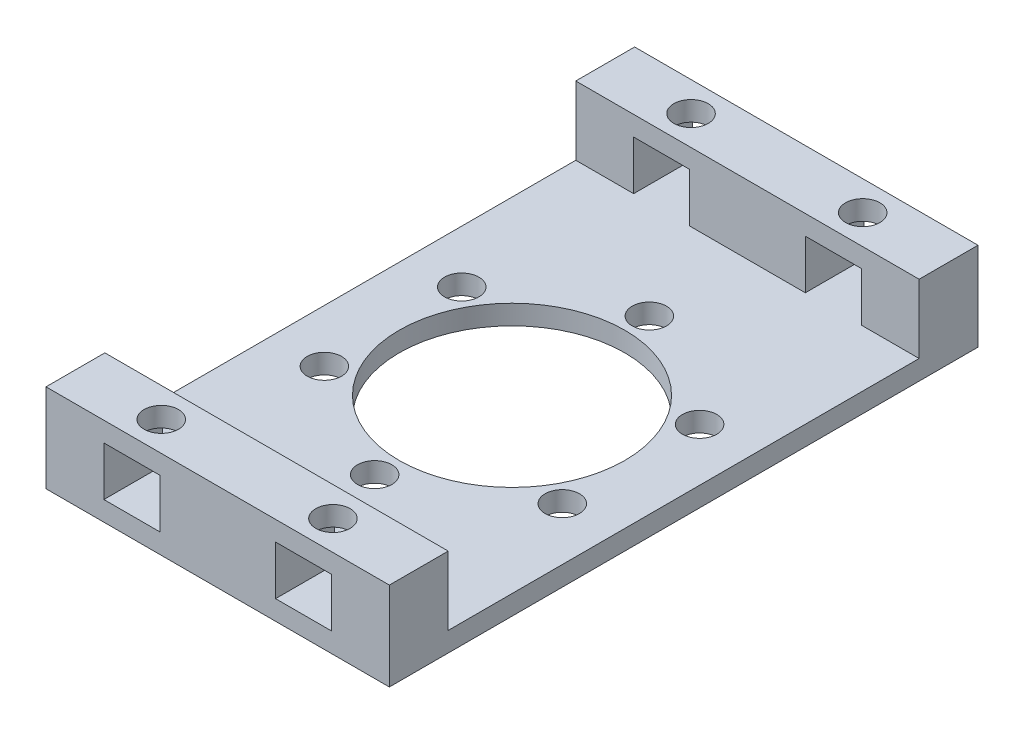
ISO-10303-21;
HEADER;
FILE_DESCRIPTION(('STEP AP214'),'2;1');
FILE_NAME('part.step','',(''),(''),'','','');
FILE_SCHEMA(('AUTOMOTIVE_DESIGN { 1 0 10303 214 1 1 1 1 }'));
ENDSEC;
DATA;
#1=APPLICATION_CONTEXT('core data for automotive mechanical design processes');
#2=APPLICATION_PROTOCOL_DEFINITION('international standard','automotive_design',2000,#1);
#3=PRODUCT_CONTEXT('',#1,'mechanical');
#4=PRODUCT('Part','Part','',(#3));
#5=PRODUCT_RELATED_PRODUCT_CATEGORY('part','',(#4));
#6=PRODUCT_DEFINITION_FORMATION('','',#4);
#7=PRODUCT_DEFINITION_CONTEXT('part definition',#1,'design');
#8=PRODUCT_DEFINITION('design','',#6,#7);
#9=PRODUCT_DEFINITION_SHAPE('','',#8);
#10=(LENGTH_UNIT() NAMED_UNIT(*) SI_UNIT(.MILLI.,.METRE.));
#11=(NAMED_UNIT(*) PLANE_ANGLE_UNIT() SI_UNIT($,.RADIAN.));
#12=(NAMED_UNIT(*) SI_UNIT($,.STERADIAN.) SOLID_ANGLE_UNIT());
#13=UNCERTAINTY_MEASURE_WITH_UNIT(LENGTH_MEASURE(1.E-05),#10,'distance_accuracy_value','');
#14=(GEOMETRIC_REPRESENTATION_CONTEXT(3) GLOBAL_UNCERTAINTY_ASSIGNED_CONTEXT((#13)) GLOBAL_UNIT_ASSIGNED_CONTEXT((#10,
#11,#12)) REPRESENTATION_CONTEXT('',''));
#15=CARTESIAN_POINT('',(0.,0.,0.));
#16=DIRECTION('',(0.,0.,1.));
#17=DIRECTION('',(1.,0.,0.));
#18=AXIS2_PLACEMENT_3D('',#15,#16,#17);
#19=CARTESIAN_POINT('',(-17.5,2.,-30.));
#20=DIRECTION('',(0.,0.,1.));
#21=DIRECTION('',(1.,0.,0.));
#22=AXIS2_PLACEMENT_3D('',#19,#20,#21);
#23=PLANE('',#22);
#24=DIRECTION('',(-1.,0.,0.));
#25=VECTOR('',#24,1.);
#26=CARTESIAN_POINT('',(-17.5,0.,-30.));
#27=LINE('',#26,#25);
#28=CARTESIAN_POINT('',(17.5,0.,-30.));
#29=VERTEX_POINT('',#28);
#30=CARTESIAN_POINT('',(-17.5,0.,-30.));
#31=VERTEX_POINT('',#30);
#32=EDGE_CURVE('E394',#29,#31,#27,.T.);
#33=ORIENTED_EDGE('',*,*,#32,.T.);
#34=DIRECTION('',(0.,-1.,0.));
#35=VECTOR('',#34,1.);
#36=CARTESIAN_POINT('',(-17.5,2.,-30.));
#37=LINE('',#36,#35);
#38=CARTESIAN_POINT('',(-17.5,9.,-30.));
#39=VERTEX_POINT('',#38);
#40=EDGE_CURVE('E404',#39,#31,#37,.T.);
#41=ORIENTED_EDGE('',*,*,#40,.F.);
#42=DIRECTION('',(-1.,0.,0.));
#43=VECTOR('',#42,1.);
#44=CARTESIAN_POINT('',(-17.5,9.,-30.));
#45=LINE('',#44,#43);
#46=CARTESIAN_POINT('',(17.5,9.,-30.));
#47=VERTEX_POINT('',#46);
#48=EDGE_CURVE('E304',#47,#39,#45,.T.);
#49=ORIENTED_EDGE('',*,*,#48,.F.);
#50=DIRECTION('',(0.,-1.,0.));
#51=VECTOR('',#50,1.);
#52=CARTESIAN_POINT('',(17.5,2.,-30.));
#53=LINE('',#52,#51);
#54=EDGE_CURVE('E407',#47,#29,#53,.T.);
#55=ORIENTED_EDGE('',*,*,#54,.T.);
#56=EDGE_LOOP('',(#33,#41,#49,#55));
#57=FACE_BOUND('',#56,.T.);
#58=DIRECTION('',(0.,1.,0.));
#59=VECTOR('',#58,1.);
#60=CARTESIAN_POINT('',(5.90000000000001,0.,-30.));
#61=LINE('',#60,#59);
#62=CARTESIAN_POINT('',(5.90000000000001,2.,-30.));
#63=VERTEX_POINT('',#62);
#64=CARTESIAN_POINT('',(5.90000000000001,7.,-30.));
#65=VERTEX_POINT('',#64);
#66=EDGE_CURVE('E260',#63,#65,#61,.T.);
#67=ORIENTED_EDGE('',*,*,#66,.F.);
#68=DIRECTION('',(1.,0.,0.));
#69=VECTOR('',#68,1.);
#70=CARTESIAN_POINT('',(0.,2.,-30.));
#71=LINE('',#70,#69);
#72=CARTESIAN_POINT('',(11.6,2.,-30.));
#73=VERTEX_POINT('',#72);
#74=EDGE_CURVE('E251',#63,#73,#71,.T.);
#75=ORIENTED_EDGE('',*,*,#74,.T.);
#76=DIRECTION('',(0.,1.,0.));
#77=VECTOR('',#76,1.);
#78=CARTESIAN_POINT('',(11.6,0.,-30.));
#79=LINE('',#78,#77);
#80=CARTESIAN_POINT('',(11.6,7.,-30.));
#81=VERTEX_POINT('',#80);
#82=EDGE_CURVE('E254',#73,#81,#79,.T.);
#83=ORIENTED_EDGE('',*,*,#82,.T.);
#84=DIRECTION('',(1.,0.,0.));
#85=VECTOR('',#84,1.);
#86=CARTESIAN_POINT('',(0.,7.,-30.));
#87=LINE('',#86,#85);
#88=EDGE_CURVE('E258',#65,#81,#87,.T.);
#89=ORIENTED_EDGE('',*,*,#88,.F.);
#90=EDGE_LOOP('',(#67,#75,#83,#89));
#91=FACE_BOUND('',#90,.T.);
#92=DIRECTION('',(1.,0.,0.));
#93=VECTOR('',#92,1.);
#94=CARTESIAN_POINT('',(0.,7.,-30.));
#95=LINE('',#94,#93);
#96=CARTESIAN_POINT('',(-11.6,7.,-30.));
#97=VERTEX_POINT('',#96);
#98=CARTESIAN_POINT('',(-5.89999999999999,7.,-30.));
#99=VERTEX_POINT('',#98);
#100=EDGE_CURVE('E209',#97,#99,#95,.T.);
#101=ORIENTED_EDGE('',*,*,#100,.F.);
#102=DIRECTION('',(0.,1.,0.));
#103=VECTOR('',#102,1.);
#104=CARTESIAN_POINT('',(-11.6,0.,-30.));
#105=LINE('',#104,#103);
#106=CARTESIAN_POINT('',(-11.6,2.,-30.));
#107=VERTEX_POINT('',#106);
#108=EDGE_CURVE('E201',#107,#97,#105,.T.);
#109=ORIENTED_EDGE('',*,*,#108,.F.);
#110=DIRECTION('',(1.,0.,0.));
#111=VECTOR('',#110,1.);
#112=CARTESIAN_POINT('',(0.,2.,-30.));
#113=LINE('',#112,#111);
#114=CARTESIAN_POINT('',(-5.89999999999999,2.,-30.));
#115=VERTEX_POINT('',#114);
#116=EDGE_CURVE('E54',#107,#115,#113,.T.);
#117=ORIENTED_EDGE('',*,*,#116,.T.);
#118=DIRECTION('',(0.,1.,0.));
#119=VECTOR('',#118,1.);
#120=CARTESIAN_POINT('',(-5.89999999999999,0.,-30.));
#121=LINE('',#120,#119);
#122=EDGE_CURVE('E222',#115,#99,#121,.T.);
#123=ORIENTED_EDGE('',*,*,#122,.T.);
#124=EDGE_LOOP('',(#101,#109,#117,#123));
#125=FACE_BOUND('',#124,.T.);
#126=ADVANCED_FACE('F39',(#57,#91,#125),#23,.F.);
#127=CARTESIAN_POINT('',(-17.5,2.,30.));
#128=DIRECTION('',(0.,0.,-1.));
#129=DIRECTION('',(-1.,0.,0.));
#130=AXIS2_PLACEMENT_3D('',#127,#128,#129);
#131=PLANE('',#130);
#132=DIRECTION('',(1.,0.,0.));
#133=VECTOR('',#132,1.);
#134=CARTESIAN_POINT('',(-17.5,0.,30.));
#135=LINE('',#134,#133);
#136=CARTESIAN_POINT('',(-17.5,0.,30.));
#137=VERTEX_POINT('',#136);
#138=CARTESIAN_POINT('',(17.5,0.,30.));
#139=VERTEX_POINT('',#138);
#140=EDGE_CURVE('E388',#137,#139,#135,.T.);
#141=ORIENTED_EDGE('',*,*,#140,.T.);
#142=DIRECTION('',(0.,-1.,0.));
#143=VECTOR('',#142,1.);
#144=CARTESIAN_POINT('',(17.5,2.,30.));
#145=LINE('',#144,#143);
#146=CARTESIAN_POINT('',(17.5,9.,30.));
#147=VERTEX_POINT('',#146);
#148=EDGE_CURVE('E391',#147,#139,#145,.T.);
#149=ORIENTED_EDGE('',*,*,#148,.F.);
#150=DIRECTION('',(1.,0.,0.));
#151=VECTOR('',#150,1.);
#152=CARTESIAN_POINT('',(-17.5,9.,30.));
#153=LINE('',#152,#151);
#154=CARTESIAN_POINT('',(-17.5,9.,30.));
#155=VERTEX_POINT('',#154);
#156=EDGE_CURVE('E324',#155,#147,#153,.T.);
#157=ORIENTED_EDGE('',*,*,#156,.F.);
#158=DIRECTION('',(0.,-1.,0.));
#159=VECTOR('',#158,1.);
#160=CARTESIAN_POINT('',(-17.5,2.,30.));
#161=LINE('',#160,#159);
#162=EDGE_CURVE('E401',#155,#137,#161,.T.);
#163=ORIENTED_EDGE('',*,*,#162,.T.);
#164=EDGE_LOOP('',(#141,#149,#157,#163));
#165=FACE_BOUND('',#164,.T.);
#166=DIRECTION('',(0.,1.,0.));
#167=VECTOR('',#166,1.);
#168=CARTESIAN_POINT('',(11.6,0.,30.));
#169=LINE('',#168,#167);
#170=CARTESIAN_POINT('',(11.6,2.,30.));
#171=VERTEX_POINT('',#170);
#172=CARTESIAN_POINT('',(11.6,7.,30.));
#173=VERTEX_POINT('',#172);
#174=EDGE_CURVE('E265',#171,#173,#169,.T.);
#175=ORIENTED_EDGE('',*,*,#174,.F.);
#176=DIRECTION('',(1.,0.,0.));
#177=VECTOR('',#176,1.);
#178=CARTESIAN_POINT('',(0.,2.,30.));
#179=LINE('',#178,#177);
#180=CARTESIAN_POINT('',(5.90000000000001,2.,30.));
#181=VERTEX_POINT('',#180);
#182=EDGE_CURVE('E263',#181,#171,#179,.T.);
#183=ORIENTED_EDGE('',*,*,#182,.F.);
#184=DIRECTION('',(0.,1.,0.));
#185=VECTOR('',#184,1.);
#186=CARTESIAN_POINT('',(5.90000000000001,0.,30.));
#187=LINE('',#186,#185);
#188=CARTESIAN_POINT('',(5.90000000000001,7.,30.));
#189=VERTEX_POINT('',#188);
#190=EDGE_CURVE('E255',#181,#189,#187,.T.);
#191=ORIENTED_EDGE('',*,*,#190,.T.);
#192=DIRECTION('',(1.,0.,0.));
#193=VECTOR('',#192,1.);
#194=CARTESIAN_POINT('',(0.,7.,30.));
#195=LINE('',#194,#193);
#196=EDGE_CURVE('E268',#189,#173,#195,.T.);
#197=ORIENTED_EDGE('',*,*,#196,.T.);
#198=EDGE_LOOP('',(#175,#183,#191,#197));
#199=FACE_BOUND('',#198,.T.);
#200=DIRECTION('',(1.,0.,0.));
#201=VECTOR('',#200,1.);
#202=CARTESIAN_POINT('',(0.,7.,30.));
#203=LINE('',#202,#201);
#204=CARTESIAN_POINT('',(-11.6,7.,30.));
#205=VERTEX_POINT('',#204);
#206=CARTESIAN_POINT('',(-5.89999999999999,7.,30.));
#207=VERTEX_POINT('',#206);
#208=EDGE_CURVE('E234',#205,#207,#203,.T.);
#209=ORIENTED_EDGE('',*,*,#208,.T.);
#210=DIRECTION('',(0.,1.,0.));
#211=VECTOR('',#210,1.);
#212=CARTESIAN_POINT('',(-5.89999999999999,0.,30.));
#213=LINE('',#212,#211);
#214=CARTESIAN_POINT('',(-5.89999999999999,2.,30.));
#215=VERTEX_POINT('',#214);
#216=EDGE_CURVE('E223',#215,#207,#213,.T.);
#217=ORIENTED_EDGE('',*,*,#216,.F.);
#218=DIRECTION('',(1.,0.,0.));
#219=VECTOR('',#218,1.);
#220=CARTESIAN_POINT('',(0.,2.,30.));
#221=LINE('',#220,#219);
#222=CARTESIAN_POINT('',(-11.6,2.,30.));
#223=VERTEX_POINT('',#222);
#224=EDGE_CURVE('E226',#223,#215,#221,.T.);
#225=ORIENTED_EDGE('',*,*,#224,.F.);
#226=DIRECTION('',(0.,1.,0.));
#227=VECTOR('',#226,1.);
#228=CARTESIAN_POINT('',(-11.6,0.,30.));
#229=LINE('',#228,#227);
#230=EDGE_CURVE('E237',#223,#205,#229,.T.);
#231=ORIENTED_EDGE('',*,*,#230,.T.);
#232=EDGE_LOOP('',(#209,#217,#225,#231));
#233=FACE_BOUND('',#232,.T.);
#234=ADVANCED_FACE('F455',(#165,#199,#233),#131,.F.);
#235=CARTESIAN_POINT('',(-17.5,9.,24.));
#236=DIRECTION('',(0.,0.,1.));
#237=DIRECTION('',(1.,0.,0.));
#238=AXIS2_PLACEMENT_3D('',#235,#236,#237);
#239=PLANE('',#238);
#240=DIRECTION('',(-1.,0.,0.));
#241=VECTOR('',#240,1.);
#242=CARTESIAN_POINT('',(-17.5,2.,24.));
#243=LINE('',#242,#241);
#244=CARTESIAN_POINT('',(5.90000000000001,2.,24.));
#245=VERTEX_POINT('',#244);
#246=CARTESIAN_POINT('',(-5.89999999999999,2.,24.));
#247=VERTEX_POINT('',#246);
#248=EDGE_CURVE('E335',#245,#247,#243,.T.);
#249=ORIENTED_EDGE('',*,*,#248,.T.);
#250=DIRECTION('',(0.,1.,0.));
#251=VECTOR('',#250,1.);
#252=CARTESIAN_POINT('',(-5.89999999999999,9.,24.));
#253=LINE('',#252,#251);
#254=CARTESIAN_POINT('',(-5.89999999999999,7.,24.));
#255=VERTEX_POINT('',#254);
#256=EDGE_CURVE('E293',#247,#255,#253,.T.);
#257=ORIENTED_EDGE('',*,*,#256,.T.);
#258=DIRECTION('',(1.,0.,0.));
#259=VECTOR('',#258,1.);
#260=CARTESIAN_POINT('',(-17.5,7.,24.));
#261=LINE('',#260,#259);
#262=CARTESIAN_POINT('',(-11.6,7.,24.));
#263=VERTEX_POINT('',#262);
#264=EDGE_CURVE('E296',#263,#255,#261,.T.);
#265=ORIENTED_EDGE('',*,*,#264,.F.);
#266=DIRECTION('',(0.,1.,0.));
#267=VECTOR('',#266,1.);
#268=CARTESIAN_POINT('',(-11.6,9.,24.));
#269=LINE('',#268,#267);
#270=CARTESIAN_POINT('',(-11.6,2.,24.));
#271=VERTEX_POINT('',#270);
#272=EDGE_CURVE('E291',#271,#263,#269,.T.);
#273=ORIENTED_EDGE('',*,*,#272,.F.);
#274=CARTESIAN_POINT('',(-17.5,2.,24.));
#275=VERTEX_POINT('',#274);
#276=EDGE_CURVE('E308',#271,#275,#243,.T.);
#277=ORIENTED_EDGE('',*,*,#276,.T.);
#278=DIRECTION('',(0.,-1.,0.));
#279=VECTOR('',#278,1.);
#280=CARTESIAN_POINT('',(-17.5,9.,24.));
#281=LINE('',#280,#279);
#282=CARTESIAN_POINT('',(-17.5,9.,24.));
#283=VERTEX_POINT('',#282);
#284=EDGE_CURVE('E332',#283,#275,#281,.T.);
#285=ORIENTED_EDGE('',*,*,#284,.F.);
#286=DIRECTION('',(-1.,0.,0.));
#287=VECTOR('',#286,1.);
#288=CARTESIAN_POINT('',(-17.5,9.,24.));
#289=LINE('',#288,#287);
#290=CARTESIAN_POINT('',(17.5,9.,24.));
#291=VERTEX_POINT('',#290);
#292=EDGE_CURVE('E330',#291,#283,#289,.T.);
#293=ORIENTED_EDGE('',*,*,#292,.F.);
#294=DIRECTION('',(0.,-1.,0.));
#295=VECTOR('',#294,1.);
#296=CARTESIAN_POINT('',(17.5,9.,24.));
#297=LINE('',#296,#295);
#298=CARTESIAN_POINT('',(17.5,2.,24.));
#299=VERTEX_POINT('',#298);
#300=EDGE_CURVE('E338',#291,#299,#297,.T.);
#301=ORIENTED_EDGE('',*,*,#300,.T.);
#302=CARTESIAN_POINT('',(11.6,2.,24.));
#303=VERTEX_POINT('',#302);
#304=EDGE_CURVE('E325',#299,#303,#243,.T.);
#305=ORIENTED_EDGE('',*,*,#304,.T.);
#306=DIRECTION('',(0.,1.,0.));
#307=VECTOR('',#306,1.);
#308=CARTESIAN_POINT('',(11.6,9.,24.));
#309=LINE('',#308,#307);
#310=CARTESIAN_POINT('',(11.6,7.,24.));
#311=VERTEX_POINT('',#310);
#312=EDGE_CURVE('E245',#303,#311,#309,.T.);
#313=ORIENTED_EDGE('',*,*,#312,.T.);
#314=DIRECTION('',(1.,0.,0.));
#315=VECTOR('',#314,1.);
#316=CARTESIAN_POINT('',(-17.5,7.,24.));
#317=LINE('',#316,#315);
#318=CARTESIAN_POINT('',(5.90000000000001,7.,24.));
#319=VERTEX_POINT('',#318);
#320=EDGE_CURVE('E286',#319,#311,#317,.T.);
#321=ORIENTED_EDGE('',*,*,#320,.F.);
#322=DIRECTION('',(0.,1.,0.));
#323=VECTOR('',#322,1.);
#324=CARTESIAN_POINT('',(5.90000000000001,9.,24.));
#325=LINE('',#324,#323);
#326=EDGE_CURVE('E289',#245,#319,#325,.T.);
#327=ORIENTED_EDGE('',*,*,#326,.F.);
#328=EDGE_LOOP('',(#249,#257,#265,#273,#277,#285,#293,#301,#305,#313,#321,#327));
#329=FACE_BOUND('',#328,.T.);
#330=ADVANCED_FACE('F438',(#329),#239,.F.);
#331=CARTESIAN_POINT('',(-17.5,9.,-24.));
#332=DIRECTION('',(0.,0.,-1.));
#333=DIRECTION('',(-1.,0.,0.));
#334=AXIS2_PLACEMENT_3D('',#331,#332,#333);
#335=PLANE('',#334);
#336=DIRECTION('',(-1.,0.,0.));
#337=VECTOR('',#336,1.);
#338=CARTESIAN_POINT('',(-17.5,7.,-24.));
#339=LINE('',#338,#337);
#340=CARTESIAN_POINT('',(-5.89999999999999,7.,-24.));
#341=VERTEX_POINT('',#340);
#342=CARTESIAN_POINT('',(-11.6,7.,-24.));
#343=VERTEX_POINT('',#342);
#344=EDGE_CURVE('E47',#341,#343,#339,.T.);
#345=ORIENTED_EDGE('',*,*,#344,.F.);
#346=DIRECTION('',(0.,-1.,0.));
#347=VECTOR('',#346,1.);
#348=CARTESIAN_POINT('',(-5.89999999999999,9.,-24.));
#349=LINE('',#348,#347);
#350=CARTESIAN_POINT('',(-5.89999999999999,2.,-24.));
#351=VERTEX_POINT('',#350);
#352=EDGE_CURVE('E11',#341,#351,#349,.T.);
#353=ORIENTED_EDGE('',*,*,#352,.T.);
#354=DIRECTION('',(1.,0.,0.));
#355=VECTOR('',#354,1.);
#356=CARTESIAN_POINT('',(-17.5,2.,-24.));
#357=LINE('',#356,#355);
#358=CARTESIAN_POINT('',(5.90000000000001,2.,-24.));
#359=VERTEX_POINT('',#358);
#360=EDGE_CURVE('E309',#351,#359,#357,.T.);
#361=ORIENTED_EDGE('',*,*,#360,.T.);
#362=DIRECTION('',(0.,-1.,0.));
#363=VECTOR('',#362,1.);
#364=CARTESIAN_POINT('',(5.90000000000001,9.,-24.));
#365=LINE('',#364,#363);
#366=CARTESIAN_POINT('',(5.90000000000001,7.,-24.));
#367=VERTEX_POINT('',#366);
#368=EDGE_CURVE('E415',#367,#359,#365,.T.);
#369=ORIENTED_EDGE('',*,*,#368,.F.);
#370=DIRECTION('',(-1.,0.,0.));
#371=VECTOR('',#370,1.);
#372=CARTESIAN_POINT('',(-17.5,7.,-24.));
#373=LINE('',#372,#371);
#374=CARTESIAN_POINT('',(11.6,7.,-24.));
#375=VERTEX_POINT('',#374);
#376=EDGE_CURVE('E413',#375,#367,#373,.T.);
#377=ORIENTED_EDGE('',*,*,#376,.F.);
#378=DIRECTION('',(0.,-1.,0.));
#379=VECTOR('',#378,1.);
#380=CARTESIAN_POINT('',(11.6,9.,-24.));
#381=LINE('',#380,#379);
#382=CARTESIAN_POINT('',(11.6,2.,-24.));
#383=VERTEX_POINT('',#382);
#384=EDGE_CURVE('E410',#375,#383,#381,.T.);
#385=ORIENTED_EDGE('',*,*,#384,.T.);
#386=CARTESIAN_POINT('',(17.5,2.,-24.));
#387=VERTEX_POINT('',#386);
#388=EDGE_CURVE('E310',#383,#387,#357,.T.);
#389=ORIENTED_EDGE('',*,*,#388,.T.);
#390=DIRECTION('',(0.,-1.,0.));
#391=VECTOR('',#390,1.);
#392=CARTESIAN_POINT('',(17.5,9.,-24.));
#393=LINE('',#392,#391);
#394=CARTESIAN_POINT('',(17.5,9.,-24.));
#395=VERTEX_POINT('',#394);
#396=EDGE_CURVE('E301',#395,#387,#393,.T.);
#397=ORIENTED_EDGE('',*,*,#396,.F.);
#398=DIRECTION('',(1.,0.,0.));
#399=VECTOR('',#398,1.);
#400=CARTESIAN_POINT('',(-17.5,9.,-24.));
#401=LINE('',#400,#399);
#402=CARTESIAN_POINT('',(-17.5,9.,-24.));
#403=VERTEX_POINT('',#402);
#404=EDGE_CURVE('E316',#403,#395,#401,.T.);
#405=ORIENTED_EDGE('',*,*,#404,.F.);
#406=DIRECTION('',(0.,-1.,0.));
#407=VECTOR('',#406,1.);
#408=CARTESIAN_POINT('',(-17.5,9.,-24.));
#409=LINE('',#408,#407);
#410=CARTESIAN_POINT('',(-17.5,2.,-24.));
#411=VERTEX_POINT('',#410);
#412=EDGE_CURVE('E298',#403,#411,#409,.T.);
#413=ORIENTED_EDGE('',*,*,#412,.T.);
#414=CARTESIAN_POINT('',(-11.6,2.,-24.));
#415=VERTEX_POINT('',#414);
#416=EDGE_CURVE('E305',#411,#415,#357,.T.);
#417=ORIENTED_EDGE('',*,*,#416,.T.);
#418=DIRECTION('',(0.,-1.,0.));
#419=VECTOR('',#418,1.);
#420=CARTESIAN_POINT('',(-11.6,9.,-24.));
#421=LINE('',#420,#419);
#422=EDGE_CURVE('E417',#343,#415,#421,.T.);
#423=ORIENTED_EDGE('',*,*,#422,.F.);
#424=EDGE_LOOP('',(#345,#353,#361,#369,#377,#385,#389,#397,#405,#413,#417,#423));
#425=FACE_BOUND('',#424,.T.);
#426=ADVANCED_FACE('F423',(#425),#335,.F.);
#427=CARTESIAN_POINT('',(0.,2.,0.));
#428=DIRECTION('',(0.,1.,0.));
#429=DIRECTION('',(0.,0.,1.));
#430=AXIS2_PLACEMENT_3D('',#427,#428,#429);
#431=PLANE('',#430);
#432=CARTESIAN_POINT('',(0.,2.,0.));
#433=DIRECTION('',(0.,1.,0.));
#434=DIRECTION('',(0.,0.,1.));
#435=AXIS2_PLACEMENT_3D('',#432,#433,#434);
#436=CIRCLE('',#435,11.5);
#437=CARTESIAN_POINT('',(0.,2.,11.5));
#438=VERTEX_POINT('',#437);
#439=EDGE_CURVE('E341',#438,#438,#436,.T.);
#440=ORIENTED_EDGE('',*,*,#439,.F.);
#441=EDGE_LOOP('',(#440));
#442=FACE_BOUND('',#441,.T.);
#443=CARTESIAN_POINT('',(12.1243556529822,2.,6.99999999999989));
#444=DIRECTION('',(0.,1.,0.));
#445=DIRECTION('',(0.,0.,1.));
#446=AXIS2_PLACEMENT_3D('',#443,#444,#445);
#447=CIRCLE('',#446,1.75000000000001);
#448=CARTESIAN_POINT('',(12.1243556529822,2.,8.7499999999999));
#449=VERTEX_POINT('',#448);
#450=EDGE_CURVE('E353',#449,#449,#447,.T.);
#451=ORIENTED_EDGE('',*,*,#450,.F.);
#452=EDGE_LOOP('',(#451));
#453=FACE_BOUND('',#452,.T.);
#454=CARTESIAN_POINT('',(12.1243556529821,2.,-7.00000000000014));
#455=DIRECTION('',(0.,1.,0.));
#456=DIRECTION('',(0.,0.,1.));
#457=AXIS2_PLACEMENT_3D('',#454,#455,#456);
#458=CIRCLE('',#457,1.75000000000001);
#459=CARTESIAN_POINT('',(12.1243556529821,2.,-5.25000000000013));
#460=VERTEX_POINT('',#459);
#461=EDGE_CURVE('E345',#460,#460,#458,.T.);
#462=ORIENTED_EDGE('',*,*,#461,.F.);
#463=EDGE_LOOP('',(#462));
#464=FACE_BOUND('',#463,.T.);
#465=DIRECTION('',(0.,0.,1.));
#466=VECTOR('',#465,1.);
#467=CARTESIAN_POINT('',(11.6,2.,-30.));
#468=LINE('',#467,#466);
#469=EDGE_CURVE('E262',#303,#171,#468,.T.);
#470=ORIENTED_EDGE('',*,*,#469,.F.);
#471=ORIENTED_EDGE('',*,*,#304,.F.);
#472=DIRECTION('',(0.,0.,-1.));
#473=VECTOR('',#472,1.);
#474=CARTESIAN_POINT('',(17.5,2.,-30.));
#475=LINE('',#474,#473);
#476=EDGE_CURVE('E384',#299,#387,#475,.T.);
#477=ORIENTED_EDGE('',*,*,#476,.T.);
#478=ORIENTED_EDGE('',*,*,#388,.F.);
#479=EDGE_CURVE('E282',#73,#383,#468,.T.);
#480=ORIENTED_EDGE('',*,*,#479,.F.);
#481=ORIENTED_EDGE('',*,*,#74,.F.);
#482=DIRECTION('',(0.,0.,1.));
#483=VECTOR('',#482,1.);
#484=CARTESIAN_POINT('',(5.90000000000001,2.,-30.));
#485=LINE('',#484,#483);
#486=EDGE_CURVE('E238',#63,#359,#485,.T.);
#487=ORIENTED_EDGE('',*,*,#486,.T.);
#488=ORIENTED_EDGE('',*,*,#360,.F.);
#489=DIRECTION('',(0.,0.,1.));
#490=VECTOR('',#489,1.);
#491=CARTESIAN_POINT('',(-5.89999999999999,2.,-30.));
#492=LINE('',#491,#490);
#493=EDGE_CURVE('E247',#115,#351,#492,.T.);
#494=ORIENTED_EDGE('',*,*,#493,.F.);
#495=ORIENTED_EDGE('',*,*,#116,.F.);
#496=DIRECTION('',(0.,0.,1.));
#497=VECTOR('',#496,1.);
#498=CARTESIAN_POINT('',(-11.6,2.,-30.));
#499=LINE('',#498,#497);
#500=EDGE_CURVE('E206',#107,#415,#499,.T.);
#501=ORIENTED_EDGE('',*,*,#500,.T.);
#502=ORIENTED_EDGE('',*,*,#416,.F.);
#503=DIRECTION('',(0.,0.,1.));
#504=VECTOR('',#503,1.);
#505=CARTESIAN_POINT('',(-17.5,2.,-30.));
#506=LINE('',#505,#504);
#507=EDGE_CURVE('E387',#411,#275,#506,.T.);
#508=ORIENTED_EDGE('',*,*,#507,.T.);
#509=ORIENTED_EDGE('',*,*,#276,.F.);
#510=EDGE_CURVE('E217',#271,#223,#499,.T.);
#511=ORIENTED_EDGE('',*,*,#510,.T.);
#512=ORIENTED_EDGE('',*,*,#224,.T.);
#513=EDGE_CURVE('E249',#247,#215,#492,.T.);
#514=ORIENTED_EDGE('',*,*,#513,.F.);
#515=ORIENTED_EDGE('',*,*,#248,.F.);
#516=EDGE_CURVE('E275',#245,#181,#485,.T.);
#517=ORIENTED_EDGE('',*,*,#516,.T.);
#518=ORIENTED_EDGE('',*,*,#182,.T.);
#519=EDGE_LOOP('',(#470,#471,#477,#478,#480,#481,#487,#488,#494,#495,#501,#502,#508,#509,#511,
#512,#514,#515,#517,#518));
#520=FACE_BOUND('',#519,.T.);
#521=CARTESIAN_POINT('',(0.,2.,-14.));
#522=DIRECTION('',(0.,1.,0.));
#523=DIRECTION('',(0.,0.,1.));
#524=AXIS2_PLACEMENT_3D('',#521,#522,#523);
#525=CIRCLE('',#524,1.75000000000001);
#526=CARTESIAN_POINT('',(0.,2.,-12.25));
#527=VERTEX_POINT('',#526);
#528=EDGE_CURVE('E377',#527,#527,#525,.T.);
#529=ORIENTED_EDGE('',*,*,#528,.F.);
#530=EDGE_LOOP('',(#529));
#531=FACE_BOUND('',#530,.T.);
#532=CARTESIAN_POINT('',(0.,2.,14.));
#533=DIRECTION('',(0.,1.,0.));
#534=DIRECTION('',(0.,0.,1.));
#535=AXIS2_PLACEMENT_3D('',#532,#533,#534);
#536=CIRCLE('',#535,1.75000000000001);
#537=CARTESIAN_POINT('',(0.,2.,15.75));
#538=VERTEX_POINT('',#537);
#539=EDGE_CURVE('E359',#538,#538,#536,.T.);
#540=ORIENTED_EDGE('',*,*,#539,.F.);
#541=EDGE_LOOP('',(#540));
#542=FACE_BOUND('',#541,.T.);
#543=CARTESIAN_POINT('',(-12.1243556529821,2.,7.00000000000006));
#544=DIRECTION('',(0.,1.,0.));
#545=DIRECTION('',(0.,0.,1.));
#546=AXIS2_PLACEMENT_3D('',#543,#544,#545);
#547=CIRCLE('',#546,1.75000000000001);
#548=CARTESIAN_POINT('',(-12.1243556529821,2.,8.75000000000007));
#549=VERTEX_POINT('',#548);
#550=EDGE_CURVE('E365',#549,#549,#547,.T.);
#551=ORIENTED_EDGE('',*,*,#550,.F.);
#552=EDGE_LOOP('',(#551));
#553=FACE_BOUND('',#552,.T.);
#554=CARTESIAN_POINT('',(-12.1243556529822,2.,-6.99999999999997));
#555=DIRECTION('',(0.,1.,0.));
#556=DIRECTION('',(0.,0.,1.));
#557=AXIS2_PLACEMENT_3D('',#554,#555,#556);
#558=CIRCLE('',#557,1.75000000000001);
#559=CARTESIAN_POINT('',(-12.1243556529822,2.,-5.24999999999996));
#560=VERTEX_POINT('',#559);
#561=EDGE_CURVE('E371',#560,#560,#558,.T.);
#562=ORIENTED_EDGE('',*,*,#561,.F.);
#563=EDGE_LOOP('',(#562));
#564=FACE_BOUND('',#563,.T.);
#565=ADVANCED_FACE('F420',(#442,#453,#464,#520,#531,#542,#553,#564),#431,.T.);
#566=CARTESIAN_POINT('',(17.5,2.,-30.));
#567=DIRECTION('',(-1.,0.,0.));
#568=DIRECTION('',(0.,0.,1.));
#569=AXIS2_PLACEMENT_3D('',#566,#567,#568);
#570=PLANE('',#569);
#571=DIRECTION('',(0.,0.,-1.));
#572=VECTOR('',#571,1.);
#573=CARTESIAN_POINT('',(17.5,0.,-30.));
#574=LINE('',#573,#572);
#575=EDGE_CURVE('E383',#139,#29,#574,.T.);
#576=ORIENTED_EDGE('',*,*,#575,.T.);
#577=ORIENTED_EDGE('',*,*,#54,.F.);
#578=DIRECTION('',(0.,0.,-1.));
#579=VECTOR('',#578,1.);
#580=CARTESIAN_POINT('',(17.5,9.,-30.));
#581=LINE('',#580,#579);
#582=EDGE_CURVE('E313',#395,#47,#581,.T.);
#583=ORIENTED_EDGE('',*,*,#582,.F.);
#584=ORIENTED_EDGE('',*,*,#396,.T.);
#585=ORIENTED_EDGE('',*,*,#476,.F.);
#586=ORIENTED_EDGE('',*,*,#300,.F.);
#587=DIRECTION('',(0.,0.,-1.));
#588=VECTOR('',#587,1.);
#589=CARTESIAN_POINT('',(17.5,9.,30.));
#590=LINE('',#589,#588);
#591=EDGE_CURVE('E328',#147,#291,#590,.T.);
#592=ORIENTED_EDGE('',*,*,#591,.F.);
#593=ORIENTED_EDGE('',*,*,#148,.T.);
#594=EDGE_LOOP('',(#576,#577,#583,#584,#585,#586,#592,#593));
#595=FACE_BOUND('',#594,.T.);
#596=ADVANCED_FACE('F41',(#595),#570,.F.);
#597=CARTESIAN_POINT('',(-17.5,2.,-30.));
#598=DIRECTION('',(1.,0.,0.));
#599=DIRECTION('',(0.,0.,-1.));
#600=AXIS2_PLACEMENT_3D('',#597,#598,#599);
#601=PLANE('',#600);
#602=DIRECTION('',(0.,0.,1.));
#603=VECTOR('',#602,1.);
#604=CARTESIAN_POINT('',(-17.5,0.,-30.));
#605=LINE('',#604,#603);
#606=EDGE_CURVE('E396',#31,#137,#605,.T.);
#607=ORIENTED_EDGE('',*,*,#606,.T.);
#608=ORIENTED_EDGE('',*,*,#162,.F.);
#609=DIRECTION('',(0.,0.,1.));
#610=VECTOR('',#609,1.);
#611=CARTESIAN_POINT('',(-17.5,9.,30.));
#612=LINE('',#611,#610);
#613=EDGE_CURVE('E321',#283,#155,#612,.T.);
#614=ORIENTED_EDGE('',*,*,#613,.F.);
#615=ORIENTED_EDGE('',*,*,#284,.T.);
#616=ORIENTED_EDGE('',*,*,#507,.F.);
#617=ORIENTED_EDGE('',*,*,#412,.F.);
#618=DIRECTION('',(0.,0.,1.));
#619=VECTOR('',#618,1.);
#620=CARTESIAN_POINT('',(-17.5,9.,-30.));
#621=LINE('',#620,#619);
#622=EDGE_CURVE('E318',#39,#403,#621,.T.);
#623=ORIENTED_EDGE('',*,*,#622,.F.);
#624=ORIENTED_EDGE('',*,*,#40,.T.);
#625=EDGE_LOOP('',(#607,#608,#614,#615,#616,#617,#623,#624));
#626=FACE_BOUND('',#625,.T.);
#627=ADVANCED_FACE('F428',(#626),#601,.F.);
#628=CARTESIAN_POINT('',(0.,0.,0.));
#629=DIRECTION('',(0.,1.,0.));
#630=DIRECTION('',(0.,0.,1.));
#631=AXIS2_PLACEMENT_3D('',#628,#629,#630);
#632=PLANE('',#631);
#633=CARTESIAN_POINT('',(0.,0.,0.));
#634=DIRECTION('',(0.,1.,0.));
#635=DIRECTION('',(0.,0.,1.));
#636=AXIS2_PLACEMENT_3D('',#633,#634,#635);
#637=CIRCLE('',#636,11.5);
#638=CARTESIAN_POINT('',(0.,0.,11.5));
#639=VERTEX_POINT('',#638);
#640=EDGE_CURVE('E342',#639,#639,#637,.T.);
#641=ORIENTED_EDGE('',*,*,#640,.T.);
#642=EDGE_LOOP('',(#641));
#643=FACE_BOUND('',#642,.T.);
#644=CARTESIAN_POINT('',(12.1243556529821,0.,-7.00000000000014));
#645=DIRECTION('',(0.,1.,0.));
#646=DIRECTION('',(0.,0.,1.));
#647=AXIS2_PLACEMENT_3D('',#644,#645,#646);
#648=CIRCLE('',#647,1.75000000000001);
#649=CARTESIAN_POINT('',(12.1243556529821,0.,-5.25000000000013));
#650=VERTEX_POINT('',#649);
#651=EDGE_CURVE('E350',#650,#650,#648,.T.);
#652=ORIENTED_EDGE('',*,*,#651,.T.);
#653=EDGE_LOOP('',(#652));
#654=FACE_BOUND('',#653,.T.);
#655=CARTESIAN_POINT('',(12.1243556529822,0.,6.99999999999989));
#656=DIRECTION('',(0.,1.,0.));
#657=DIRECTION('',(0.,0.,1.));
#658=AXIS2_PLACEMENT_3D('',#655,#656,#657);
#659=CIRCLE('',#658,1.75000000000001);
#660=CARTESIAN_POINT('',(12.1243556529822,0.,8.7499999999999));
#661=VERTEX_POINT('',#660);
#662=EDGE_CURVE('E356',#661,#661,#659,.T.);
#663=ORIENTED_EDGE('',*,*,#662,.T.);
#664=EDGE_LOOP('',(#663));
#665=FACE_BOUND('',#664,.T.);
#666=CARTESIAN_POINT('',(0.,0.,14.));
#667=DIRECTION('',(0.,1.,0.));
#668=DIRECTION('',(0.,0.,1.));
#669=AXIS2_PLACEMENT_3D('',#666,#667,#668);
#670=CIRCLE('',#669,1.75000000000001);
#671=CARTESIAN_POINT('',(0.,0.,15.75));
#672=VERTEX_POINT('',#671);
#673=EDGE_CURVE('E362',#672,#672,#670,.T.);
#674=ORIENTED_EDGE('',*,*,#673,.T.);
#675=EDGE_LOOP('',(#674));
#676=FACE_BOUND('',#675,.T.);
#677=CARTESIAN_POINT('',(-12.1243556529821,0.,7.00000000000006));
#678=DIRECTION('',(0.,1.,0.));
#679=DIRECTION('',(0.,0.,1.));
#680=AXIS2_PLACEMENT_3D('',#677,#678,#679);
#681=CIRCLE('',#680,1.75000000000001);
#682=CARTESIAN_POINT('',(-12.1243556529821,0.,8.75000000000007));
#683=VERTEX_POINT('',#682);
#684=EDGE_CURVE('E368',#683,#683,#681,.T.);
#685=ORIENTED_EDGE('',*,*,#684,.T.);
#686=EDGE_LOOP('',(#685));
#687=FACE_BOUND('',#686,.T.);
#688=CARTESIAN_POINT('',(-12.1243556529822,0.,-6.99999999999997));
#689=DIRECTION('',(0.,1.,0.));
#690=DIRECTION('',(0.,0.,1.));
#691=AXIS2_PLACEMENT_3D('',#688,#689,#690);
#692=CIRCLE('',#691,1.75000000000001);
#693=CARTESIAN_POINT('',(-12.1243556529822,0.,-5.24999999999996));
#694=VERTEX_POINT('',#693);
#695=EDGE_CURVE('E374',#694,#694,#692,.T.);
#696=ORIENTED_EDGE('',*,*,#695,.T.);
#697=EDGE_LOOP('',(#696));
#698=FACE_BOUND('',#697,.T.);
#699=CARTESIAN_POINT('',(0.,0.,-14.));
#700=DIRECTION('',(0.,1.,0.));
#701=DIRECTION('',(0.,0.,1.));
#702=AXIS2_PLACEMENT_3D('',#699,#700,#701);
#703=CIRCLE('',#702,1.75000000000001);
#704=CARTESIAN_POINT('',(0.,0.,-12.25));
#705=VERTEX_POINT('',#704);
#706=EDGE_CURVE('E380',#705,#705,#703,.T.);
#707=ORIENTED_EDGE('',*,*,#706,.T.);
#708=EDGE_LOOP('',(#707));
#709=FACE_BOUND('',#708,.T.);
#710=ORIENTED_EDGE('',*,*,#575,.F.);
#711=ORIENTED_EDGE('',*,*,#140,.F.);
#712=ORIENTED_EDGE('',*,*,#606,.F.);
#713=ORIENTED_EDGE('',*,*,#32,.F.);
#714=EDGE_LOOP('',(#710,#711,#712,#713));
#715=FACE_BOUND('',#714,.T.);
#716=ADVANCED_FACE('F468',(#643,#654,#665,#676,#687,#698,#709,#715),#632,.F.);
#717=CARTESIAN_POINT('',(0.,2.,-14.));
#718=DIRECTION('',(0.,1.,0.));
#719=DIRECTION('',(0.,0.,1.));
#720=AXIS2_PLACEMENT_3D('',#717,#718,#719);
#721=CYLINDRICAL_SURFACE('',#720,1.75000000000001);
#722=ORIENTED_EDGE('',*,*,#706,.F.);
#723=EDGE_LOOP('',(#722));
#724=FACE_BOUND('',#723,.T.);
#725=ORIENTED_EDGE('',*,*,#528,.T.);
#726=EDGE_LOOP('',(#725));
#727=FACE_BOUND('',#726,.T.);
#728=ADVANCED_FACE('F475',(#724,#727),#721,.F.);
#729=CARTESIAN_POINT('',(-12.1243556529822,2.,-6.99999999999997));
#730=DIRECTION('',(0.,1.,0.));
#731=DIRECTION('',(0.,0.,1.));
#732=AXIS2_PLACEMENT_3D('',#729,#730,#731);
#733=CYLINDRICAL_SURFACE('',#732,1.75000000000001);
#734=ORIENTED_EDGE('',*,*,#695,.F.);
#735=EDGE_LOOP('',(#734));
#736=FACE_BOUND('',#735,.T.);
#737=ORIENTED_EDGE('',*,*,#561,.T.);
#738=EDGE_LOOP('',(#737));
#739=FACE_BOUND('',#738,.T.);
#740=ADVANCED_FACE('F534',(#736,#739),#733,.F.);
#741=CARTESIAN_POINT('',(-12.1243556529821,2.,7.00000000000006));
#742=DIRECTION('',(0.,1.,0.));
#743=DIRECTION('',(0.,0.,1.));
#744=AXIS2_PLACEMENT_3D('',#741,#742,#743);
#745=CYLINDRICAL_SURFACE('',#744,1.75000000000001);
#746=ORIENTED_EDGE('',*,*,#684,.F.);
#747=EDGE_LOOP('',(#746));
#748=FACE_BOUND('',#747,.T.);
#749=ORIENTED_EDGE('',*,*,#550,.T.);
#750=EDGE_LOOP('',(#749));
#751=FACE_BOUND('',#750,.T.);
#752=ADVANCED_FACE('F530',(#748,#751),#745,.F.);
#753=CARTESIAN_POINT('',(0.,2.,14.));
#754=DIRECTION('',(0.,1.,0.));
#755=DIRECTION('',(0.,0.,1.));
#756=AXIS2_PLACEMENT_3D('',#753,#754,#755);
#757=CYLINDRICAL_SURFACE('',#756,1.75000000000001);
#758=ORIENTED_EDGE('',*,*,#673,.F.);
#759=EDGE_LOOP('',(#758));
#760=FACE_BOUND('',#759,.T.);
#761=ORIENTED_EDGE('',*,*,#539,.T.);
#762=EDGE_LOOP('',(#761));
#763=FACE_BOUND('',#762,.T.);
#764=ADVANCED_FACE('F526',(#760,#763),#757,.F.);
#765=CARTESIAN_POINT('',(12.1243556529822,2.,6.99999999999989));
#766=DIRECTION('',(0.,1.,0.));
#767=DIRECTION('',(0.,0.,1.));
#768=AXIS2_PLACEMENT_3D('',#765,#766,#767);
#769=CYLINDRICAL_SURFACE('',#768,1.75000000000001);
#770=ORIENTED_EDGE('',*,*,#662,.F.);
#771=EDGE_LOOP('',(#770));
#772=FACE_BOUND('',#771,.T.);
#773=ORIENTED_EDGE('',*,*,#450,.T.);
#774=EDGE_LOOP('',(#773));
#775=FACE_BOUND('',#774,.T.);
#776=ADVANCED_FACE('F522',(#772,#775),#769,.F.);
#777=CARTESIAN_POINT('',(12.1243556529821,2.,-7.00000000000014));
#778=DIRECTION('',(0.,1.,0.));
#779=DIRECTION('',(0.,0.,1.));
#780=AXIS2_PLACEMENT_3D('',#777,#778,#779);
#781=CYLINDRICAL_SURFACE('',#780,1.75000000000001);
#782=ORIENTED_EDGE('',*,*,#651,.F.);
#783=EDGE_LOOP('',(#782));
#784=FACE_BOUND('',#783,.T.);
#785=ORIENTED_EDGE('',*,*,#461,.T.);
#786=EDGE_LOOP('',(#785));
#787=FACE_BOUND('',#786,.T.);
#788=ADVANCED_FACE('F513',(#784,#787),#781,.F.);
#789=CARTESIAN_POINT('',(0.,0.,0.));
#790=DIRECTION('',(0.,1.,0.));
#791=DIRECTION('',(0.,0.,1.));
#792=AXIS2_PLACEMENT_3D('',#789,#790,#791);
#793=CYLINDRICAL_SURFACE('',#792,11.5);
#794=ORIENTED_EDGE('',*,*,#640,.F.);
#795=EDGE_LOOP('',(#794));
#796=FACE_BOUND('',#795,.T.);
#797=ORIENTED_EDGE('',*,*,#439,.T.);
#798=EDGE_LOOP('',(#797));
#799=FACE_BOUND('',#798,.T.);
#800=ADVANCED_FACE('F502',(#796,#799),#793,.F.);
#801=CARTESIAN_POINT('',(0.,9.,0.));
#802=DIRECTION('',(0.,-1.,0.));
#803=DIRECTION('',(0.,0.,-1.));
#804=AXIS2_PLACEMENT_3D('',#801,#802,#803);
#805=PLANE('',#804);
#806=CARTESIAN_POINT('',(-8.74999999999999,9.,27.));
#807=DIRECTION('',(0.,1.,0.));
#808=DIRECTION('',(0.,0.,1.));
#809=AXIS2_PLACEMENT_3D('',#806,#807,#808);
#810=CIRCLE('',#809,1.75000000000001);
#811=CARTESIAN_POINT('',(-8.74999999999999,9.,28.75));
#812=VERTEX_POINT('',#811);
#813=EDGE_CURVE('E835',#812,#812,#810,.T.);
#814=ORIENTED_EDGE('',*,*,#813,.F.);
#815=EDGE_LOOP('',(#814));
#816=FACE_BOUND('',#815,.T.);
#817=CARTESIAN_POINT('',(8.75000000000001,9.,27.));
#818=DIRECTION('',(0.,1.,0.));
#819=DIRECTION('',(0.,0.,1.));
#820=AXIS2_PLACEMENT_3D('',#817,#818,#819);
#821=CIRCLE('',#820,1.75000000000001);
#822=CARTESIAN_POINT('',(8.75000000000001,9.,28.75));
#823=VERTEX_POINT('',#822);
#824=EDGE_CURVE('E840',#823,#823,#821,.T.);
#825=ORIENTED_EDGE('',*,*,#824,.F.);
#826=EDGE_LOOP('',(#825));
#827=FACE_BOUND('',#826,.T.);
#828=ORIENTED_EDGE('',*,*,#613,.T.);
#829=ORIENTED_EDGE('',*,*,#156,.T.);
#830=ORIENTED_EDGE('',*,*,#591,.T.);
#831=ORIENTED_EDGE('',*,*,#292,.T.);
#832=EDGE_LOOP('',(#828,#829,#830,#831));
#833=FACE_BOUND('',#832,.T.);
#834=ADVANCED_FACE('F499',(#816,#827,#833),#805,.F.);
#835=CARTESIAN_POINT('',(0.,9.,0.));
#836=DIRECTION('',(0.,1.,0.));
#837=DIRECTION('',(0.,0.,1.));
#838=AXIS2_PLACEMENT_3D('',#835,#836,#837);
#839=PLANE('',#838);
#840=CARTESIAN_POINT('',(-8.74999999999999,9.,-27.));
#841=DIRECTION('',(0.,1.,0.));
#842=DIRECTION('',(0.,0.,1.));
#843=AXIS2_PLACEMENT_3D('',#840,#841,#842);
#844=CIRCLE('',#843,1.75000000000001);
#845=CARTESIAN_POINT('',(-8.74999999999999,9.,-25.25));
#846=VERTEX_POINT('',#845);
#847=EDGE_CURVE('E822',#846,#846,#844,.T.);
#848=ORIENTED_EDGE('',*,*,#847,.F.);
#849=EDGE_LOOP('',(#848));
#850=FACE_BOUND('',#849,.T.);
#851=CARTESIAN_POINT('',(8.75000000000001,9.,-27.));
#852=DIRECTION('',(0.,1.,0.));
#853=DIRECTION('',(0.,0.,1.));
#854=AXIS2_PLACEMENT_3D('',#851,#852,#853);
#855=CIRCLE('',#854,1.75000000000001);
#856=CARTESIAN_POINT('',(8.75000000000001,9.,-25.25));
#857=VERTEX_POINT('',#856);
#858=EDGE_CURVE('E826',#857,#857,#855,.T.);
#859=ORIENTED_EDGE('',*,*,#858,.F.);
#860=EDGE_LOOP('',(#859));
#861=FACE_BOUND('',#860,.T.);
#862=ORIENTED_EDGE('',*,*,#622,.T.);
#863=ORIENTED_EDGE('',*,*,#404,.T.);
#864=ORIENTED_EDGE('',*,*,#582,.T.);
#865=ORIENTED_EDGE('',*,*,#48,.T.);
#866=EDGE_LOOP('',(#862,#863,#864,#865));
#867=FACE_BOUND('',#866,.T.);
#868=ADVANCED_FACE('F491',(#850,#861,#867),#839,.T.);
#869=CARTESIAN_POINT('',(11.6,0.,-30.));
#870=DIRECTION('',(1.,0.,0.));
#871=DIRECTION('',(0.,0.,-1.));
#872=AXIS2_PLACEMENT_3D('',#869,#870,#871);
#873=PLANE('',#872);
#874=DIRECTION('',(0.,0.,1.));
#875=VECTOR('',#874,1.);
#876=CARTESIAN_POINT('',(11.6,7.,-30.));
#877=LINE('',#876,#875);
#878=EDGE_CURVE('E62',#81,#375,#877,.T.);
#879=ORIENTED_EDGE('',*,*,#878,.F.);
#880=ORIENTED_EDGE('',*,*,#82,.F.);
#881=ORIENTED_EDGE('',*,*,#479,.T.);
#882=ORIENTED_EDGE('',*,*,#384,.F.);
#883=EDGE_LOOP('',(#879,#880,#881,#882));
#884=FACE_BOUND('',#883,.T.);
#885=ADVANCED_FACE('F509',(#884),#873,.F.);
#886=CARTESIAN_POINT('',(0.,7.,-30.));
#887=DIRECTION('',(0.,-1.,0.));
#888=DIRECTION('',(0.,0.,-1.));
#889=AXIS2_PLACEMENT_3D('',#886,#887,#888);
#890=PLANE('',#889);
#891=CARTESIAN_POINT('',(8.75000000000001,7.,-27.));
#892=DIRECTION('',(0.,-1.,0.));
#893=DIRECTION('',(0.,0.,-1.));
#894=AXIS2_PLACEMENT_3D('',#891,#892,#893);
#895=CIRCLE('',#894,1.75000000000001);
#896=CARTESIAN_POINT('',(8.75000000000001,7.,-28.75));
#897=VERTEX_POINT('',#896);
#898=EDGE_CURVE('E829',#897,#897,#895,.T.);
#899=ORIENTED_EDGE('',*,*,#898,.F.);
#900=EDGE_LOOP('',(#899));
#901=FACE_BOUND('',#900,.T.);
#902=ORIENTED_EDGE('',*,*,#376,.T.);
#903=DIRECTION('',(0.,0.,1.));
#904=VECTOR('',#903,1.);
#905=CARTESIAN_POINT('',(5.90000000000001,7.,-30.));
#906=LINE('',#905,#904);
#907=EDGE_CURVE('E276',#65,#367,#906,.T.);
#908=ORIENTED_EDGE('',*,*,#907,.F.);
#909=ORIENTED_EDGE('',*,*,#88,.T.);
#910=ORIENTED_EDGE('',*,*,#878,.T.);
#911=EDGE_LOOP('',(#902,#908,#909,#910));
#912=FACE_BOUND('',#911,.T.);
#913=ADVANCED_FACE('F657',(#901,#912),#890,.T.);
#914=CARTESIAN_POINT('',(5.90000000000001,0.,-30.));
#915=DIRECTION('',(1.,0.,0.));
#916=DIRECTION('',(0.,0.,-1.));
#917=AXIS2_PLACEMENT_3D('',#914,#915,#916);
#918=PLANE('',#917);
#919=ORIENTED_EDGE('',*,*,#368,.T.);
#920=ORIENTED_EDGE('',*,*,#486,.F.);
#921=ORIENTED_EDGE('',*,*,#66,.T.);
#922=ORIENTED_EDGE('',*,*,#907,.T.);
#923=EDGE_LOOP('',(#919,#920,#921,#922));
#924=FACE_BOUND('',#923,.T.);
#925=ADVANCED_FACE('F667',(#924),#918,.T.);
#926=CARTESIAN_POINT('',(-11.6,0.,-30.));
#927=DIRECTION('',(1.,0.,0.));
#928=DIRECTION('',(0.,0.,-1.));
#929=AXIS2_PLACEMENT_3D('',#926,#927,#928);
#930=PLANE('',#929);
#931=ORIENTED_EDGE('',*,*,#422,.T.);
#932=ORIENTED_EDGE('',*,*,#500,.F.);
#933=ORIENTED_EDGE('',*,*,#108,.T.);
#934=DIRECTION('',(0.,0.,1.));
#935=VECTOR('',#934,1.);
#936=CARTESIAN_POINT('',(-11.6,7.,-30.));
#937=LINE('',#936,#935);
#938=EDGE_CURVE('E204',#97,#343,#937,.T.);
#939=ORIENTED_EDGE('',*,*,#938,.T.);
#940=EDGE_LOOP('',(#931,#932,#933,#939));
#941=FACE_BOUND('',#940,.T.);
#942=ADVANCED_FACE('F203',(#941),#930,.T.);
#943=CARTESIAN_POINT('',(-5.89999999999999,0.,-30.));
#944=DIRECTION('',(1.,0.,0.));
#945=DIRECTION('',(0.,0.,-1.));
#946=AXIS2_PLACEMENT_3D('',#943,#944,#945);
#947=PLANE('',#946);
#948=DIRECTION('',(0.,0.,1.));
#949=VECTOR('',#948,1.);
#950=CARTESIAN_POINT('',(-5.89999999999999,7.,-30.));
#951=LINE('',#950,#949);
#952=EDGE_CURVE('E243',#99,#341,#951,.T.);
#953=ORIENTED_EDGE('',*,*,#952,.F.);
#954=ORIENTED_EDGE('',*,*,#122,.F.);
#955=ORIENTED_EDGE('',*,*,#493,.T.);
#956=ORIENTED_EDGE('',*,*,#352,.F.);
#957=EDGE_LOOP('',(#953,#954,#955,#956));
#958=FACE_BOUND('',#957,.T.);
#959=ADVANCED_FACE('F688',(#958),#947,.F.);
#960=CARTESIAN_POINT('',(0.,7.,-30.));
#961=DIRECTION('',(0.,-1.,0.));
#962=DIRECTION('',(0.,0.,-1.));
#963=AXIS2_PLACEMENT_3D('',#960,#961,#962);
#964=PLANE('',#963);
#965=CARTESIAN_POINT('',(-8.74999999999999,7.,-27.));
#966=DIRECTION('',(0.,-1.,0.));
#967=DIRECTION('',(0.,0.,-1.));
#968=AXIS2_PLACEMENT_3D('',#965,#966,#967);
#969=CIRCLE('',#968,1.75000000000001);
#970=CARTESIAN_POINT('',(-8.74999999999999,7.,-28.75));
#971=VERTEX_POINT('',#970);
#972=EDGE_CURVE('E825',#971,#971,#969,.T.);
#973=ORIENTED_EDGE('',*,*,#972,.F.);
#974=EDGE_LOOP('',(#973));
#975=FACE_BOUND('',#974,.T.);
#976=ORIENTED_EDGE('',*,*,#344,.T.);
#977=ORIENTED_EDGE('',*,*,#938,.F.);
#978=ORIENTED_EDGE('',*,*,#100,.T.);
#979=ORIENTED_EDGE('',*,*,#952,.T.);
#980=EDGE_LOOP('',(#976,#977,#978,#979));
#981=FACE_BOUND('',#980,.T.);
#982=ADVANCED_FACE('F212',(#975,#981),#964,.T.);
#983=ORIENTED_EDGE('',*,*,#326,.T.);
#984=EDGE_CURVE('E279',#319,#189,#906,.T.);
#985=ORIENTED_EDGE('',*,*,#984,.T.);
#986=ORIENTED_EDGE('',*,*,#190,.F.);
#987=ORIENTED_EDGE('',*,*,#516,.F.);
#988=EDGE_LOOP('',(#983,#985,#986,#987));
#989=FACE_BOUND('',#988,.T.);
#990=ADVANCED_FACE('F680',(#989),#918,.T.);
#991=CARTESIAN_POINT('',(8.75000000000001,7.,27.));
#992=DIRECTION('',(0.,-1.,0.));
#993=DIRECTION('',(0.,0.,-1.));
#994=AXIS2_PLACEMENT_3D('',#991,#992,#993);
#995=CIRCLE('',#994,1.75000000000001);
#996=CARTESIAN_POINT('',(8.75000000000001,7.,25.25));
#997=VERTEX_POINT('',#996);
#998=EDGE_CURVE('E229',#997,#997,#995,.T.);
#999=ORIENTED_EDGE('',*,*,#998,.F.);
#1000=EDGE_LOOP('',(#999));
#1001=FACE_BOUND('',#1000,.T.);
#1002=ORIENTED_EDGE('',*,*,#320,.T.);
#1003=EDGE_CURVE('E281',#311,#173,#877,.T.);
#1004=ORIENTED_EDGE('',*,*,#1003,.T.);
#1005=ORIENTED_EDGE('',*,*,#196,.F.);
#1006=ORIENTED_EDGE('',*,*,#984,.F.);
#1007=EDGE_LOOP('',(#1002,#1004,#1005,#1006));
#1008=FACE_BOUND('',#1007,.T.);
#1009=ADVANCED_FACE('F670',(#1001,#1008),#890,.T.);
#1010=ORIENTED_EDGE('',*,*,#469,.T.);
#1011=ORIENTED_EDGE('',*,*,#174,.T.);
#1012=ORIENTED_EDGE('',*,*,#1003,.F.);
#1013=ORIENTED_EDGE('',*,*,#312,.F.);
#1014=EDGE_LOOP('',(#1010,#1011,#1012,#1013));
#1015=FACE_BOUND('',#1014,.T.);
#1016=ADVANCED_FACE('F659',(#1015),#873,.F.);
#1017=CARTESIAN_POINT('',(-8.74999999999999,7.,27.));
#1018=DIRECTION('',(0.,-1.,0.));
#1019=DIRECTION('',(0.,0.,-1.));
#1020=AXIS2_PLACEMENT_3D('',#1017,#1018,#1019);
#1021=CIRCLE('',#1020,1.75000000000001);
#1022=CARTESIAN_POINT('',(-8.74999999999999,7.,25.25));
#1023=VERTEX_POINT('',#1022);
#1024=EDGE_CURVE('E838',#1023,#1023,#1021,.T.);
#1025=ORIENTED_EDGE('',*,*,#1024,.F.);
#1026=EDGE_LOOP('',(#1025));
#1027=FACE_BOUND('',#1026,.T.);
#1028=ORIENTED_EDGE('',*,*,#264,.T.);
#1029=EDGE_CURVE('E246',#255,#207,#951,.T.);
#1030=ORIENTED_EDGE('',*,*,#1029,.T.);
#1031=ORIENTED_EDGE('',*,*,#208,.F.);
#1032=EDGE_CURVE('E218',#263,#205,#937,.T.);
#1033=ORIENTED_EDGE('',*,*,#1032,.F.);
#1034=EDGE_LOOP('',(#1028,#1030,#1031,#1033));
#1035=FACE_BOUND('',#1034,.T.);
#1036=ADVANCED_FACE('F449',(#1027,#1035),#964,.T.);
#1037=ORIENTED_EDGE('',*,*,#513,.T.);
#1038=ORIENTED_EDGE('',*,*,#216,.T.);
#1039=ORIENTED_EDGE('',*,*,#1029,.F.);
#1040=ORIENTED_EDGE('',*,*,#256,.F.);
#1041=EDGE_LOOP('',(#1037,#1038,#1039,#1040));
#1042=FACE_BOUND('',#1041,.T.);
#1043=ADVANCED_FACE('F446',(#1042),#947,.F.);
#1044=ORIENTED_EDGE('',*,*,#272,.T.);
#1045=ORIENTED_EDGE('',*,*,#1032,.T.);
#1046=ORIENTED_EDGE('',*,*,#230,.F.);
#1047=ORIENTED_EDGE('',*,*,#510,.F.);
#1048=EDGE_LOOP('',(#1044,#1045,#1046,#1047));
#1049=FACE_BOUND('',#1048,.T.);
#1050=ADVANCED_FACE('F453',(#1049),#930,.T.);
#1051=CARTESIAN_POINT('',(8.75000000000001,9.,27.));
#1052=DIRECTION('',(0.,1.,0.));
#1053=DIRECTION('',(0.,0.,1.));
#1054=AXIS2_PLACEMENT_3D('',#1051,#1052,#1053);
#1055=CYLINDRICAL_SURFACE('',#1054,1.75000000000001);
#1056=ORIENTED_EDGE('',*,*,#824,.T.);
#1057=EDGE_LOOP('',(#1056));
#1058=FACE_BOUND('',#1057,.T.);
#1059=ORIENTED_EDGE('',*,*,#998,.T.);
#1060=EDGE_LOOP('',(#1059));
#1061=FACE_BOUND('',#1060,.T.);
#1062=ADVANCED_FACE('F753',(#1058,#1061),#1055,.F.);
#1063=CARTESIAN_POINT('',(-8.74999999999999,9.,27.));
#1064=DIRECTION('',(0.,1.,0.));
#1065=DIRECTION('',(0.,0.,1.));
#1066=AXIS2_PLACEMENT_3D('',#1063,#1064,#1065);
#1067=CYLINDRICAL_SURFACE('',#1066,1.75000000000001);
#1068=ORIENTED_EDGE('',*,*,#813,.T.);
#1069=EDGE_LOOP('',(#1068));
#1070=FACE_BOUND('',#1069,.T.);
#1071=ORIENTED_EDGE('',*,*,#1024,.T.);
#1072=EDGE_LOOP('',(#1071));
#1073=FACE_BOUND('',#1072,.T.);
#1074=ADVANCED_FACE('F761',(#1070,#1073),#1067,.F.);
#1075=CARTESIAN_POINT('',(8.75000000000001,9.,-27.));
#1076=DIRECTION('',(0.,1.,0.));
#1077=DIRECTION('',(0.,0.,1.));
#1078=AXIS2_PLACEMENT_3D('',#1075,#1076,#1077);
#1079=CYLINDRICAL_SURFACE('',#1078,1.75000000000001);
#1080=ORIENTED_EDGE('',*,*,#858,.T.);
#1081=EDGE_LOOP('',(#1080));
#1082=FACE_BOUND('',#1081,.T.);
#1083=ORIENTED_EDGE('',*,*,#898,.T.);
#1084=EDGE_LOOP('',(#1083));
#1085=FACE_BOUND('',#1084,.T.);
#1086=ADVANCED_FACE('F770',(#1082,#1085),#1079,.F.);
#1087=CARTESIAN_POINT('',(-8.74999999999999,9.,-27.));
#1088=DIRECTION('',(0.,1.,0.));
#1089=DIRECTION('',(0.,0.,1.));
#1090=AXIS2_PLACEMENT_3D('',#1087,#1088,#1089);
#1091=CYLINDRICAL_SURFACE('',#1090,1.75000000000001);
#1092=ORIENTED_EDGE('',*,*,#847,.T.);
#1093=EDGE_LOOP('',(#1092));
#1094=FACE_BOUND('',#1093,.T.);
#1095=ORIENTED_EDGE('',*,*,#972,.T.);
#1096=EDGE_LOOP('',(#1095));
#1097=FACE_BOUND('',#1096,.T.);
#1098=ADVANCED_FACE('F779',(#1094,#1097),#1091,.F.);
#1099=CLOSED_SHELL('',(#126,#234,#330,#426,#565,#596,#627,#716,#728,#740,#752,#764,#776,#788,
#800,#834,#868,#885,#913,#925,#942,#959,#982,#990,#1009,#1016,#1036,#1043,#1050,#1062,#1074,
#1086,#1098));
#1100=MANIFOLD_SOLID_BREP('B2',#1099);
#1101=ADVANCED_BREP_SHAPE_REPRESENTATION('',(#18,#1100),#14);
#1102=SHAPE_DEFINITION_REPRESENTATION(#9,#1101);
ENDSEC;
END-ISO-10303-21;
